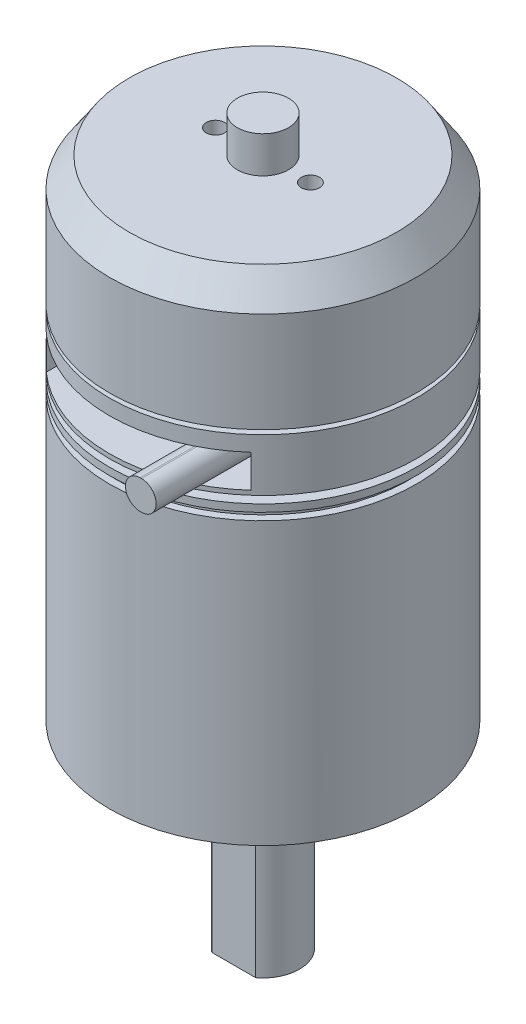
ISO-10303-21;
HEADER;
FILE_DESCRIPTION(('STEP AP214'),'2;1');
FILE_NAME('part.step','',(''),(''),'','','');
FILE_SCHEMA(('AUTOMOTIVE_DESIGN { 1 0 10303 214 1 1 1 1 }'));
ENDSEC;
DATA;
#1=APPLICATION_CONTEXT('core data for automotive mechanical design processes');
#2=APPLICATION_PROTOCOL_DEFINITION('international standard','automotive_design',2000,#1);
#3=PRODUCT_CONTEXT('',#1,'mechanical');
#4=PRODUCT('Part','Part','',(#3));
#5=PRODUCT_RELATED_PRODUCT_CATEGORY('part','',(#4));
#6=PRODUCT_DEFINITION_FORMATION('','',#4);
#7=PRODUCT_DEFINITION_CONTEXT('part definition',#1,'design');
#8=PRODUCT_DEFINITION('design','',#6,#7);
#9=PRODUCT_DEFINITION_SHAPE('','',#8);
#10=(LENGTH_UNIT() NAMED_UNIT(*) SI_UNIT(.MILLI.,.METRE.));
#11=(NAMED_UNIT(*) PLANE_ANGLE_UNIT() SI_UNIT($,.RADIAN.));
#12=(NAMED_UNIT(*) SI_UNIT($,.STERADIAN.) SOLID_ANGLE_UNIT());
#13=UNCERTAINTY_MEASURE_WITH_UNIT(LENGTH_MEASURE(1.E-05),#10,'distance_accuracy_value','');
#14=(GEOMETRIC_REPRESENTATION_CONTEXT(3) GLOBAL_UNCERTAINTY_ASSIGNED_CONTEXT((#13)) GLOBAL_UNIT_ASSIGNED_CONTEXT((#10,
#11,#12)) REPRESENTATION_CONTEXT('',''));
#15=CARTESIAN_POINT('',(0.,0.,0.));
#16=DIRECTION('',(0.,0.,1.));
#17=DIRECTION('',(1.,0.,0.));
#18=AXIS2_PLACEMENT_3D('',#15,#16,#17);
#19=CARTESIAN_POINT('',(0.,0.,11.));
#20=DIRECTION('',(0.,0.,1.));
#21=DIRECTION('',(1.,0.,0.));
#22=AXIS2_PLACEMENT_3D('',#19,#20,#21);
#23=PLANE('',#22);
#24=DIRECTION('',(0.,1.,0.));
#25=VECTOR('',#24,1.);
#26=CARTESIAN_POINT('',(14.,18.3,11.));
#27=LINE('',#26,#25);
#28=CARTESIAN_POINT('',(14.,13.8,11.));
#29=VERTEX_POINT('',#28);
#30=CARTESIAN_POINT('',(14.,18.3,11.));
#31=VERTEX_POINT('',#30);
#32=EDGE_CURVE('E238',#29,#31,#27,.T.);
#33=ORIENTED_EDGE('',*,*,#32,.T.);
#34=DIRECTION('',(-1.,0.,0.));
#35=VECTOR('',#34,1.);
#36=CARTESIAN_POINT('',(-14.,18.3,11.));
#37=LINE('',#36,#35);
#38=CARTESIAN_POINT('',(-14.,18.3,11.));
#39=VERTEX_POINT('',#38);
#40=EDGE_CURVE('E241',#31,#39,#37,.T.);
#41=ORIENTED_EDGE('',*,*,#40,.T.);
#42=DIRECTION('',(0.,-1.,0.));
#43=VECTOR('',#42,1.);
#44=CARTESIAN_POINT('',(-14.,18.3,11.));
#45=LINE('',#44,#43);
#46=CARTESIAN_POINT('',(-14.,13.8,11.));
#47=VERTEX_POINT('',#46);
#48=EDGE_CURVE('E244',#39,#47,#45,.T.);
#49=ORIENTED_EDGE('',*,*,#48,.T.);
#50=DIRECTION('',(1.,0.,0.));
#51=VECTOR('',#50,1.);
#52=CARTESIAN_POINT('',(-14.,13.8,11.));
#53=LINE('',#52,#51);
#54=EDGE_CURVE('E247',#47,#29,#53,.T.);
#55=ORIENTED_EDGE('',*,*,#54,.T.);
#56=EDGE_LOOP('',(#33,#41,#49,#55));
#57=FACE_BOUND('',#56,.T.);
#58=DIRECTION('',(1.,0.,0.));
#59=VECTOR('',#58,1.);
#60=CARTESIAN_POINT('',(9.18505632343501,14.0531944170925,11.));
#61=LINE('',#60,#59);
#62=CARTESIAN_POINT('',(9.18505632343501,14.0531944170925,11.));
#63=VERTEX_POINT('',#62);
#64=CARTESIAN_POINT('',(9.38505632343501,14.0531944170925,11.));
#65=VERTEX_POINT('',#64);
#66=EDGE_CURVE('E225',#63,#65,#61,.T.);
#67=ORIENTED_EDGE('',*,*,#66,.F.);
#68=CARTESIAN_POINT('',(9.18505632343501,16.0531944170925,11.));
#69=DIRECTION('',(0.,0.,1.));
#70=DIRECTION('',(1.,0.,0.));
#71=AXIS2_PLACEMENT_3D('',#68,#69,#70);
#72=CIRCLE('',#71,1.99999999999999);
#73=CARTESIAN_POINT('',(9.18505632343501,18.0531944170925,11.));
#74=VERTEX_POINT('',#73);
#75=EDGE_CURVE('E211',#74,#63,#72,.T.);
#76=ORIENTED_EDGE('',*,*,#75,.F.);
#77=DIRECTION('',(-1.,0.,0.));
#78=VECTOR('',#77,1.);
#79=CARTESIAN_POINT('',(9.18505632343501,18.0531944170925,11.));
#80=LINE('',#79,#78);
#81=CARTESIAN_POINT('',(9.38505632343501,18.0531944170925,11.));
#82=VERTEX_POINT('',#81);
#83=EDGE_CURVE('E216',#82,#74,#80,.T.);
#84=ORIENTED_EDGE('',*,*,#83,.F.);
#85=CARTESIAN_POINT('',(9.38505632343501,16.0531944170925,11.));
#86=DIRECTION('',(0.,0.,1.));
#87=DIRECTION('',(1.,0.,0.));
#88=AXIS2_PLACEMENT_3D('',#85,#86,#87);
#89=CIRCLE('',#88,2.);
#90=EDGE_CURVE('E227',#65,#82,#89,.T.);
#91=ORIENTED_EDGE('',*,*,#90,.F.);
#92=EDGE_LOOP('',(#67,#76,#84,#91));
#93=FACE_BOUND('',#92,.T.);
#94=ADVANCED_FACE('F41',(#57,#93),#23,.T.);
#95=CARTESIAN_POINT('',(0.,43.7,0.));
#96=DIRECTION('',(0.,1.,0.));
#97=DIRECTION('',(0.,0.,1.));
#98=AXIS2_PLACEMENT_3D('',#95,#96,#97);
#99=CYLINDRICAL_SURFACE('',#98,21.);
#100=CARTESIAN_POINT('',(0.,10.2,0.));
#101=DIRECTION('',(0.,1.,0.));
#102=DIRECTION('',(0.,0.,1.));
#103=AXIS2_PLACEMENT_3D('',#100,#101,#102);
#104=CIRCLE('',#103,21.);
#105=CARTESIAN_POINT('',(0.,10.2,21.));
#106=VERTEX_POINT('',#105);
#107=EDGE_CURVE('E307',#106,#106,#104,.T.);
#108=ORIENTED_EDGE('',*,*,#107,.F.);
#109=EDGE_LOOP('',(#108));
#110=FACE_BOUND('',#109,.T.);
#111=CARTESIAN_POINT('',(0.,-28.3,0.));
#112=DIRECTION('',(0.,1.,0.));
#113=DIRECTION('',(-1.,0.,0.));
#114=AXIS2_PLACEMENT_3D('',#111,#112,#113);
#115=CIRCLE('',#114,21.);
#116=CARTESIAN_POINT('',(-21.,-28.3,0.));
#117=VERTEX_POINT('',#116);
#118=EDGE_CURVE('E177',#117,#117,#115,.T.);
#119=ORIENTED_EDGE('',*,*,#118,.T.);
#120=EDGE_LOOP('',(#119));
#121=FACE_BOUND('',#120,.T.);
#122=ADVANCED_FACE('F43',(#110,#121),#99,.T.);
#123=CARTESIAN_POINT('',(21.,10.2,0.));
#124=DIRECTION('',(0.,-1.,0.));
#125=DIRECTION('',(0.,0.,-1.));
#126=AXIS2_PLACEMENT_3D('',#123,#124,#125);
#127=PLANE('',#126);
#128=CARTESIAN_POINT('',(0.,10.2,0.));
#129=DIRECTION('',(0.,1.,0.));
#130=DIRECTION('',(0.,0.,1.));
#131=AXIS2_PLACEMENT_3D('',#128,#129,#130);
#132=CIRCLE('',#131,20.);
#133=CARTESIAN_POINT('',(0.,10.2,20.));
#134=VERTEX_POINT('',#133);
#135=EDGE_CURVE('E304',#134,#134,#132,.T.);
#136=ORIENTED_EDGE('',*,*,#135,.F.);
#137=EDGE_LOOP('',(#136));
#138=FACE_BOUND('',#137,.T.);
#139=ORIENTED_EDGE('',*,*,#107,.T.);
#140=EDGE_LOOP('',(#139));
#141=FACE_BOUND('',#140,.T.);
#142=ADVANCED_FACE('F350',(#138,#141),#127,.F.);
#143=CARTESIAN_POINT('',(0.,43.7,0.));
#144=DIRECTION('',(0.,1.,0.));
#145=DIRECTION('',(0.,0.,1.));
#146=AXIS2_PLACEMENT_3D('',#143,#144,#145);
#147=CYLINDRICAL_SURFACE('',#146,20.);
#148=CARTESIAN_POINT('',(0.,11.2,0.));
#149=DIRECTION('',(0.,1.,0.));
#150=DIRECTION('',(0.,0.,1.));
#151=AXIS2_PLACEMENT_3D('',#148,#149,#150);
#152=CIRCLE('',#151,20.);
#153=CARTESIAN_POINT('',(0.,11.2,20.));
#154=VERTEX_POINT('',#153);
#155=EDGE_CURVE('E301',#154,#154,#152,.T.);
#156=ORIENTED_EDGE('',*,*,#155,.F.);
#157=EDGE_LOOP('',(#156));
#158=FACE_BOUND('',#157,.T.);
#159=ORIENTED_EDGE('',*,*,#135,.T.);
#160=EDGE_LOOP('',(#159));
#161=FACE_BOUND('',#160,.T.);
#162=ADVANCED_FACE('F414',(#158,#161),#147,.T.);
#163=CARTESIAN_POINT('',(20.,11.2,0.));
#164=DIRECTION('',(0.,1.,0.));
#165=DIRECTION('',(0.,0.,1.));
#166=AXIS2_PLACEMENT_3D('',#163,#164,#165);
#167=PLANE('',#166);
#168=CARTESIAN_POINT('',(0.,11.2,0.));
#169=DIRECTION('',(0.,1.,0.));
#170=DIRECTION('',(0.,0.,1.));
#171=AXIS2_PLACEMENT_3D('',#168,#169,#170);
#172=CIRCLE('',#171,21.);
#173=CARTESIAN_POINT('',(0.,11.2,21.));
#174=VERTEX_POINT('',#173);
#175=EDGE_CURVE('E298',#174,#174,#172,.T.);
#176=ORIENTED_EDGE('',*,*,#175,.F.);
#177=EDGE_LOOP('',(#176));
#178=FACE_BOUND('',#177,.T.);
#179=ORIENTED_EDGE('',*,*,#155,.T.);
#180=EDGE_LOOP('',(#179));
#181=FACE_BOUND('',#180,.T.);
#182=ADVANCED_FACE('F410',(#178,#181),#167,.F.);
#183=CARTESIAN_POINT('',(0.,43.7,0.));
#184=DIRECTION('',(0.,1.,0.));
#185=DIRECTION('',(0.,0.,1.));
#186=AXIS2_PLACEMENT_3D('',#183,#184,#185);
#187=CYLINDRICAL_SURFACE('',#186,21.);
#188=CARTESIAN_POINT('',(0.,12.2,0.));
#189=DIRECTION('',(0.,1.,0.));
#190=DIRECTION('',(0.,0.,1.));
#191=AXIS2_PLACEMENT_3D('',#188,#189,#190);
#192=CIRCLE('',#191,21.);
#193=CARTESIAN_POINT('',(0.,12.2,21.));
#194=VERTEX_POINT('',#193);
#195=EDGE_CURVE('E295',#194,#194,#192,.T.);
#196=ORIENTED_EDGE('',*,*,#195,.F.);
#197=EDGE_LOOP('',(#196));
#198=FACE_BOUND('',#197,.T.);
#199=ORIENTED_EDGE('',*,*,#175,.T.);
#200=EDGE_LOOP('',(#199));
#201=FACE_BOUND('',#200,.T.);
#202=ADVANCED_FACE('F406',(#198,#201),#187,.T.);
#203=CARTESIAN_POINT('',(21.,12.2,0.));
#204=DIRECTION('',(0.,-1.,0.));
#205=DIRECTION('',(0.,0.,-1.));
#206=AXIS2_PLACEMENT_3D('',#203,#204,#205);
#207=PLANE('',#206);
#208=CARTESIAN_POINT('',(0.,12.2,0.));
#209=DIRECTION('',(0.,1.,0.));
#210=DIRECTION('',(0.,0.,1.));
#211=AXIS2_PLACEMENT_3D('',#208,#209,#210);
#212=CIRCLE('',#211,10.);
#213=CARTESIAN_POINT('',(0.,12.2,10.));
#214=VERTEX_POINT('',#213);
#215=EDGE_CURVE('E292',#214,#214,#212,.T.);
#216=ORIENTED_EDGE('',*,*,#215,.F.);
#217=EDGE_LOOP('',(#216));
#218=FACE_BOUND('',#217,.T.);
#219=ORIENTED_EDGE('',*,*,#195,.T.);
#220=EDGE_LOOP('',(#219));
#221=FACE_BOUND('',#220,.T.);
#222=ADVANCED_FACE('F402',(#218,#221),#207,.F.);
#223=CARTESIAN_POINT('',(0.,43.7,0.));
#224=DIRECTION('',(0.,1.,0.));
#225=DIRECTION('',(0.,0.,1.));
#226=AXIS2_PLACEMENT_3D('',#223,#224,#225);
#227=CYLINDRICAL_SURFACE('',#226,10.);
#228=CARTESIAN_POINT('',(0.,13.2,0.));
#229=DIRECTION('',(0.,1.,0.));
#230=DIRECTION('',(0.,0.,1.));
#231=AXIS2_PLACEMENT_3D('',#228,#229,#230);
#232=CIRCLE('',#231,10.);
#233=CARTESIAN_POINT('',(0.,13.2,10.));
#234=VERTEX_POINT('',#233);
#235=EDGE_CURVE('E289',#234,#234,#232,.T.);
#236=ORIENTED_EDGE('',*,*,#235,.F.);
#237=EDGE_LOOP('',(#236));
#238=FACE_BOUND('',#237,.T.);
#239=ORIENTED_EDGE('',*,*,#215,.T.);
#240=EDGE_LOOP('',(#239));
#241=FACE_BOUND('',#240,.T.);
#242=ADVANCED_FACE('F398',(#238,#241),#227,.T.);
#243=CARTESIAN_POINT('',(10.,13.2,0.));
#244=DIRECTION('',(0.,1.,0.));
#245=DIRECTION('',(0.,0.,1.));
#246=AXIS2_PLACEMENT_3D('',#243,#244,#245);
#247=PLANE('',#246);
#248=CARTESIAN_POINT('',(0.,13.2,0.));
#249=DIRECTION('',(0.,1.,0.));
#250=DIRECTION('',(0.,0.,1.));
#251=AXIS2_PLACEMENT_3D('',#248,#249,#250);
#252=CIRCLE('',#251,21.);
#253=CARTESIAN_POINT('',(0.,13.2,21.));
#254=VERTEX_POINT('',#253);
#255=EDGE_CURVE('E286',#254,#254,#252,.T.);
#256=ORIENTED_EDGE('',*,*,#255,.F.);
#257=EDGE_LOOP('',(#256));
#258=FACE_BOUND('',#257,.T.);
#259=ORIENTED_EDGE('',*,*,#235,.T.);
#260=EDGE_LOOP('',(#259));
#261=FACE_BOUND('',#260,.T.);
#262=ADVANCED_FACE('F395',(#258,#261),#247,.F.);
#263=CARTESIAN_POINT('',(0.,43.7,0.));
#264=DIRECTION('',(0.,1.,0.));
#265=DIRECTION('',(0.,0.,1.));
#266=AXIS2_PLACEMENT_3D('',#263,#264,#265);
#267=CYLINDRICAL_SURFACE('',#266,21.);
#268=CARTESIAN_POINT('',(0.,18.3,0.));
#269=DIRECTION('',(0.,1.,0.));
#270=DIRECTION('',(0.,0.,1.));
#271=AXIS2_PLACEMENT_3D('',#268,#269,#270);
#272=CIRCLE('',#271,21.);
#273=CARTESIAN_POINT('',(-14.,18.3,15.6524758424985));
#274=VERTEX_POINT('',#273);
#275=CARTESIAN_POINT('',(14.,18.3,15.6524758424985));
#276=VERTEX_POINT('',#275);
#277=EDGE_CURVE('E310',#274,#276,#272,.T.);
#278=ORIENTED_EDGE('',*,*,#277,.T.);
#279=DIRECTION('',(0.,1.,0.));
#280=VECTOR('',#279,1.);
#281=CARTESIAN_POINT('',(14.,43.7,15.6524758424985));
#282=LINE('',#281,#280);
#283=CARTESIAN_POINT('',(14.,13.8,15.6524758424985));
#284=VERTEX_POINT('',#283);
#285=EDGE_CURVE('E11',#276,#284,#282,.F.);
#286=ORIENTED_EDGE('',*,*,#285,.T.);
#287=CARTESIAN_POINT('',(0.,13.8,0.));
#288=DIRECTION('',(0.,-1.,0.));
#289=DIRECTION('',(0.,0.,-1.));
#290=AXIS2_PLACEMENT_3D('',#287,#288,#289);
#291=CIRCLE('',#290,21.);
#292=CARTESIAN_POINT('',(-14.,13.8,15.6524758424985));
#293=VERTEX_POINT('',#292);
#294=EDGE_CURVE('E49',#284,#293,#291,.T.);
#295=ORIENTED_EDGE('',*,*,#294,.T.);
#296=DIRECTION('',(0.,1.,0.));
#297=VECTOR('',#296,1.);
#298=CARTESIAN_POINT('',(-14.,43.7,15.6524758424985));
#299=LINE('',#298,#297);
#300=EDGE_CURVE('E312',#293,#274,#299,.T.);
#301=ORIENTED_EDGE('',*,*,#300,.T.);
#302=EDGE_LOOP('',(#278,#286,#295,#301));
#303=FACE_BOUND('',#302,.T.);
#304=CARTESIAN_POINT('',(0.,20.4,0.));
#305=DIRECTION('',(0.,1.,0.));
#306=DIRECTION('',(0.,0.,1.));
#307=AXIS2_PLACEMENT_3D('',#304,#305,#306);
#308=CIRCLE('',#307,21.);
#309=CARTESIAN_POINT('',(0.,20.4,21.));
#310=VERTEX_POINT('',#309);
#311=EDGE_CURVE('E283',#310,#310,#308,.T.);
#312=ORIENTED_EDGE('',*,*,#311,.F.);
#313=EDGE_LOOP('',(#312));
#314=FACE_BOUND('',#313,.T.);
#315=ORIENTED_EDGE('',*,*,#255,.T.);
#316=EDGE_LOOP('',(#315));
#317=FACE_BOUND('',#316,.T.);
#318=ADVANCED_FACE('F316',(#303,#314,#317),#267,.T.);
#319=CARTESIAN_POINT('',(21.,20.4,0.));
#320=DIRECTION('',(0.,-1.,0.));
#321=DIRECTION('',(0.,0.,-1.));
#322=AXIS2_PLACEMENT_3D('',#319,#320,#321);
#323=PLANE('',#322);
#324=CARTESIAN_POINT('',(0.,20.4,0.));
#325=DIRECTION('',(0.,1.,0.));
#326=DIRECTION('',(0.,0.,1.));
#327=AXIS2_PLACEMENT_3D('',#324,#325,#326);
#328=CIRCLE('',#327,5.);
#329=CARTESIAN_POINT('',(0.,20.4,5.));
#330=VERTEX_POINT('',#329);
#331=EDGE_CURVE('E280',#330,#330,#328,.T.);
#332=ORIENTED_EDGE('',*,*,#331,.F.);
#333=EDGE_LOOP('',(#332));
#334=FACE_BOUND('',#333,.T.);
#335=ORIENTED_EDGE('',*,*,#311,.T.);
#336=EDGE_LOOP('',(#335));
#337=FACE_BOUND('',#336,.T.);
#338=ADVANCED_FACE('F388',(#334,#337),#323,.F.);
#339=CARTESIAN_POINT('',(0.,43.7,0.));
#340=DIRECTION('',(0.,1.,0.));
#341=DIRECTION('',(0.,0.,1.));
#342=AXIS2_PLACEMENT_3D('',#339,#340,#341);
#343=CYLINDRICAL_SURFACE('',#342,5.);
#344=CARTESIAN_POINT('',(0.,21.,0.));
#345=DIRECTION('',(0.,1.,0.));
#346=DIRECTION('',(0.,0.,1.));
#347=AXIS2_PLACEMENT_3D('',#344,#345,#346);
#348=CIRCLE('',#347,5.);
#349=CARTESIAN_POINT('',(0.,21.,5.));
#350=VERTEX_POINT('',#349);
#351=EDGE_CURVE('E277',#350,#350,#348,.T.);
#352=ORIENTED_EDGE('',*,*,#351,.F.);
#353=EDGE_LOOP('',(#352));
#354=FACE_BOUND('',#353,.T.);
#355=ORIENTED_EDGE('',*,*,#331,.T.);
#356=EDGE_LOOP('',(#355));
#357=FACE_BOUND('',#356,.T.);
#358=ADVANCED_FACE('F384',(#354,#357),#343,.T.);
#359=CARTESIAN_POINT('',(5.,21.,0.));
#360=DIRECTION('',(0.,1.,0.));
#361=DIRECTION('',(0.,0.,1.));
#362=AXIS2_PLACEMENT_3D('',#359,#360,#361);
#363=PLANE('',#362);
#364=CARTESIAN_POINT('',(0.,21.,0.));
#365=DIRECTION('',(0.,1.,0.));
#366=DIRECTION('',(0.,0.,1.));
#367=AXIS2_PLACEMENT_3D('',#364,#365,#366);
#368=CIRCLE('',#367,21.);
#369=CARTESIAN_POINT('',(0.,21.,21.));
#370=VERTEX_POINT('',#369);
#371=EDGE_CURVE('E274',#370,#370,#368,.T.);
#372=ORIENTED_EDGE('',*,*,#371,.F.);
#373=EDGE_LOOP('',(#372));
#374=FACE_BOUND('',#373,.T.);
#375=ORIENTED_EDGE('',*,*,#351,.T.);
#376=EDGE_LOOP('',(#375));
#377=FACE_BOUND('',#376,.T.);
#378=ADVANCED_FACE('F380',(#374,#377),#363,.F.);
#379=CARTESIAN_POINT('',(0.,43.7,0.));
#380=DIRECTION('',(0.,1.,0.));
#381=DIRECTION('',(0.,0.,1.));
#382=AXIS2_PLACEMENT_3D('',#379,#380,#381);
#383=CYLINDRICAL_SURFACE('',#382,21.);
#384=CARTESIAN_POINT('',(0.,34.7,0.));
#385=DIRECTION('',(0.,1.,0.));
#386=DIRECTION('',(0.,0.,1.));
#387=AXIS2_PLACEMENT_3D('',#384,#385,#386);
#388=CIRCLE('',#387,21.);
#389=CARTESIAN_POINT('',(0.,34.7,21.));
#390=VERTEX_POINT('',#389);
#391=EDGE_CURVE('E271',#390,#390,#388,.T.);
#392=ORIENTED_EDGE('',*,*,#391,.F.);
#393=EDGE_LOOP('',(#392));
#394=FACE_BOUND('',#393,.T.);
#395=ORIENTED_EDGE('',*,*,#371,.T.);
#396=EDGE_LOOP('',(#395));
#397=FACE_BOUND('',#396,.T.);
#398=ADVANCED_FACE('F376',(#394,#397),#383,.T.);
#399=CARTESIAN_POINT('',(0.,34.7,0.));
#400=DIRECTION('',(0.,-1.,0.));
#401=DIRECTION('',(0.,0.,-1.));
#402=AXIS2_PLACEMENT_3D('',#399,#400,#401);
#403=CONICAL_SURFACE('',#402,21.,0.593749666710772);
#404=CARTESIAN_POINT('',(0.,38.7,0.));
#405=DIRECTION('',(0.,1.,0.));
#406=DIRECTION('',(0.,0.,1.));
#407=AXIS2_PLACEMENT_3D('',#404,#405,#406);
#408=CIRCLE('',#407,18.3);
#409=CARTESIAN_POINT('',(0.,38.7,18.3));
#410=VERTEX_POINT('',#409);
#411=EDGE_CURVE('E268',#410,#410,#408,.T.);
#412=ORIENTED_EDGE('',*,*,#411,.F.);
#413=EDGE_LOOP('',(#412));
#414=FACE_BOUND('',#413,.T.);
#415=ORIENTED_EDGE('',*,*,#391,.T.);
#416=EDGE_LOOP('',(#415));
#417=FACE_BOUND('',#416,.T.);
#418=ADVANCED_FACE('F372',(#414,#417),#403,.T.);
#419=CARTESIAN_POINT('',(18.3,38.7,0.));
#420=DIRECTION('',(0.,-1.,0.));
#421=DIRECTION('',(0.,0.,-1.));
#422=AXIS2_PLACEMENT_3D('',#419,#420,#421);
#423=PLANE('',#422);
#424=CARTESIAN_POINT('',(-6.5,38.7,0.));
#425=DIRECTION('',(0.,1.,0.));
#426=DIRECTION('',(0.,0.,1.));
#427=AXIS2_PLACEMENT_3D('',#424,#425,#426);
#428=CIRCLE('',#427,1.24999999999999);
#429=CARTESIAN_POINT('',(-6.5,38.7,1.24999999999999));
#430=VERTEX_POINT('',#429);
#431=EDGE_CURVE('E199',#430,#430,#428,.T.);
#432=ORIENTED_EDGE('',*,*,#431,.F.);
#433=EDGE_LOOP('',(#432));
#434=FACE_BOUND('',#433,.T.);
#435=CARTESIAN_POINT('',(6.5,38.7,0.));
#436=DIRECTION('',(0.,1.,0.));
#437=DIRECTION('',(0.,0.,1.));
#438=AXIS2_PLACEMENT_3D('',#435,#436,#437);
#439=CIRCLE('',#438,1.24999999999999);
#440=CARTESIAN_POINT('',(6.5,38.7,1.24999999999999));
#441=VERTEX_POINT('',#440);
#442=EDGE_CURVE('E205',#441,#441,#439,.T.);
#443=ORIENTED_EDGE('',*,*,#442,.F.);
#444=EDGE_LOOP('',(#443));
#445=FACE_BOUND('',#444,.T.);
#446=CARTESIAN_POINT('',(0.,38.7,0.));
#447=DIRECTION('',(0.,1.,0.));
#448=DIRECTION('',(0.,0.,1.));
#449=AXIS2_PLACEMENT_3D('',#446,#447,#448);
#450=CIRCLE('',#449,3.5);
#451=CARTESIAN_POINT('',(0.,38.7,3.5));
#452=VERTEX_POINT('',#451);
#453=EDGE_CURVE('E265',#452,#452,#450,.T.);
#454=ORIENTED_EDGE('',*,*,#453,.F.);
#455=EDGE_LOOP('',(#454));
#456=FACE_BOUND('',#455,.T.);
#457=ORIENTED_EDGE('',*,*,#411,.T.);
#458=EDGE_LOOP('',(#457));
#459=FACE_BOUND('',#458,.T.);
#460=ADVANCED_FACE('F368',(#434,#445,#456,#459),#423,.F.);
#461=CARTESIAN_POINT('',(0.,43.7,0.));
#462=DIRECTION('',(0.,1.,0.));
#463=DIRECTION('',(0.,0.,1.));
#464=AXIS2_PLACEMENT_3D('',#461,#462,#463);
#465=CYLINDRICAL_SURFACE('',#464,3.5);
#466=CARTESIAN_POINT('',(0.,43.7,0.));
#467=DIRECTION('',(0.,1.,0.));
#468=DIRECTION('',(0.,0.,1.));
#469=AXIS2_PLACEMENT_3D('',#466,#467,#468);
#470=CIRCLE('',#469,3.5);
#471=CARTESIAN_POINT('',(0.,43.7,3.5));
#472=VERTEX_POINT('',#471);
#473=EDGE_CURVE('E254',#472,#472,#470,.T.);
#474=ORIENTED_EDGE('',*,*,#473,.F.);
#475=EDGE_LOOP('',(#474));
#476=FACE_BOUND('',#475,.T.);
#477=ORIENTED_EDGE('',*,*,#453,.T.);
#478=EDGE_LOOP('',(#477));
#479=FACE_BOUND('',#478,.T.);
#480=ADVANCED_FACE('F362',(#476,#479),#465,.T.);
#481=CARTESIAN_POINT('',(3.5,43.7,0.));
#482=DIRECTION('',(0.,-1.,0.));
#483=DIRECTION('',(0.,0.,-1.));
#484=AXIS2_PLACEMENT_3D('',#481,#482,#483);
#485=PLANE('',#484);
#486=ORIENTED_EDGE('',*,*,#473,.T.);
#487=EDGE_LOOP('',(#486));
#488=FACE_BOUND('',#487,.T.);
#489=ADVANCED_FACE('F358',(#488),#485,.F.);
#490=CARTESIAN_POINT('',(14.,18.3,11.));
#491=DIRECTION('',(1.,0.,0.));
#492=DIRECTION('',(0.,0.,-1.));
#493=AXIS2_PLACEMENT_3D('',#490,#491,#492);
#494=PLANE('',#493);
#495=DIRECTION('',(0.,0.,1.));
#496=VECTOR('',#495,1.);
#497=CARTESIAN_POINT('',(14.,18.3,11.));
#498=LINE('',#497,#496);
#499=EDGE_CURVE('E250',#31,#276,#498,.T.);
#500=ORIENTED_EDGE('',*,*,#499,.F.);
#501=ORIENTED_EDGE('',*,*,#32,.F.);
#502=DIRECTION('',(0.,0.,1.));
#503=VECTOR('',#502,1.);
#504=CARTESIAN_POINT('',(14.,13.8,11.));
#505=LINE('',#504,#503);
#506=EDGE_CURVE('E251',#29,#284,#505,.T.);
#507=ORIENTED_EDGE('',*,*,#506,.T.);
#508=ORIENTED_EDGE('',*,*,#285,.F.);
#509=EDGE_LOOP('',(#500,#501,#507,#508));
#510=FACE_BOUND('',#509,.T.);
#511=ADVANCED_FACE('F324',(#510),#494,.F.);
#512=CARTESIAN_POINT('',(-14.,13.8,11.));
#513=DIRECTION('',(0.,-1.,0.));
#514=DIRECTION('',(0.,0.,-1.));
#515=AXIS2_PLACEMENT_3D('',#512,#513,#514);
#516=PLANE('',#515);
#517=ORIENTED_EDGE('',*,*,#506,.F.);
#518=ORIENTED_EDGE('',*,*,#54,.F.);
#519=DIRECTION('',(0.,0.,1.));
#520=VECTOR('',#519,1.);
#521=CARTESIAN_POINT('',(-14.,13.8,11.));
#522=LINE('',#521,#520);
#523=EDGE_CURVE('E255',#47,#293,#522,.T.);
#524=ORIENTED_EDGE('',*,*,#523,.T.);
#525=ORIENTED_EDGE('',*,*,#294,.F.);
#526=EDGE_LOOP('',(#517,#518,#524,#525));
#527=FACE_BOUND('',#526,.T.);
#528=ADVANCED_FACE('F320',(#527),#516,.F.);
#529=CARTESIAN_POINT('',(-14.,18.3,11.));
#530=DIRECTION('',(-1.,0.,0.));
#531=DIRECTION('',(0.,-1.,0.));
#532=AXIS2_PLACEMENT_3D('',#529,#530,#531);
#533=PLANE('',#532);
#534=ORIENTED_EDGE('',*,*,#523,.F.);
#535=ORIENTED_EDGE('',*,*,#48,.F.);
#536=DIRECTION('',(0.,0.,1.));
#537=VECTOR('',#536,1.);
#538=CARTESIAN_POINT('',(-14.,18.3,11.));
#539=LINE('',#538,#537);
#540=EDGE_CURVE('E258',#39,#274,#539,.T.);
#541=ORIENTED_EDGE('',*,*,#540,.T.);
#542=ORIENTED_EDGE('',*,*,#300,.F.);
#543=EDGE_LOOP('',(#534,#535,#541,#542));
#544=FACE_BOUND('',#543,.T.);
#545=ADVANCED_FACE('F330',(#544),#533,.F.);
#546=CARTESIAN_POINT('',(-14.,18.3,11.));
#547=DIRECTION('',(0.,1.,0.));
#548=DIRECTION('',(0.,0.,1.));
#549=AXIS2_PLACEMENT_3D('',#546,#547,#548);
#550=PLANE('',#549);
#551=ORIENTED_EDGE('',*,*,#277,.F.);
#552=ORIENTED_EDGE('',*,*,#540,.F.);
#553=ORIENTED_EDGE('',*,*,#40,.F.);
#554=ORIENTED_EDGE('',*,*,#499,.T.);
#555=EDGE_LOOP('',(#551,#552,#553,#554));
#556=FACE_BOUND('',#555,.T.);
#557=ADVANCED_FACE('F332',(#556),#550,.F.);
#558=CARTESIAN_POINT('',(9.18505632343501,16.0531944170925,26.));
#559=DIRECTION('',(0.,0.,-1.));
#560=DIRECTION('',(-1.,0.,0.));
#561=AXIS2_PLACEMENT_3D('',#558,#559,#560);
#562=CYLINDRICAL_SURFACE('',#561,1.99999999999999);
#563=ORIENTED_EDGE('',*,*,#75,.T.);
#564=DIRECTION('',(0.,0.,-1.));
#565=VECTOR('',#564,1.);
#566=CARTESIAN_POINT('',(9.18505632343501,14.0531944170925,26.));
#567=LINE('',#566,#565);
#568=CARTESIAN_POINT('',(9.18505632343501,14.0531944170925,26.));
#569=VERTEX_POINT('',#568);
#570=EDGE_CURVE('E236',#569,#63,#567,.T.);
#571=ORIENTED_EDGE('',*,*,#570,.F.);
#572=CARTESIAN_POINT('',(9.18505632343501,16.0531944170925,26.));
#573=DIRECTION('',(0.,0.,1.));
#574=DIRECTION('',(1.,0.,0.));
#575=AXIS2_PLACEMENT_3D('',#572,#573,#574);
#576=CIRCLE('',#575,1.99999999999999);
#577=CARTESIAN_POINT('',(9.18505632343501,18.0531944170925,26.));
#578=VERTEX_POINT('',#577);
#579=EDGE_CURVE('E212',#578,#569,#576,.T.);
#580=ORIENTED_EDGE('',*,*,#579,.F.);
#581=DIRECTION('',(0.,0.,-1.));
#582=VECTOR('',#581,1.);
#583=CARTESIAN_POINT('',(9.18505632343501,18.0531944170925,26.));
#584=LINE('',#583,#582);
#585=EDGE_CURVE('E222',#578,#74,#584,.T.);
#586=ORIENTED_EDGE('',*,*,#585,.T.);
#587=EDGE_LOOP('',(#563,#571,#580,#586));
#588=FACE_BOUND('',#587,.T.);
#589=ADVANCED_FACE('F334',(#588),#562,.T.);
#590=CARTESIAN_POINT('',(9.18505632343501,14.0531944170925,26.));
#591=DIRECTION('',(0.,1.,0.));
#592=DIRECTION('',(-1.,0.,0.));
#593=AXIS2_PLACEMENT_3D('',#590,#591,#592);
#594=PLANE('',#593);
#595=ORIENTED_EDGE('',*,*,#66,.T.);
#596=DIRECTION('',(0.,0.,-1.));
#597=VECTOR('',#596,1.);
#598=CARTESIAN_POINT('',(9.38505632343501,14.0531944170925,26.));
#599=LINE('',#598,#597);
#600=CARTESIAN_POINT('',(9.38505632343501,14.0531944170925,26.));
#601=VERTEX_POINT('',#600);
#602=EDGE_CURVE('E233',#601,#65,#599,.T.);
#603=ORIENTED_EDGE('',*,*,#602,.F.);
#604=DIRECTION('',(1.,0.,0.));
#605=VECTOR('',#604,1.);
#606=CARTESIAN_POINT('',(9.18505632343501,14.0531944170925,26.));
#607=LINE('',#606,#605);
#608=EDGE_CURVE('E215',#569,#601,#607,.T.);
#609=ORIENTED_EDGE('',*,*,#608,.F.);
#610=ORIENTED_EDGE('',*,*,#570,.T.);
#611=EDGE_LOOP('',(#595,#603,#609,#610));
#612=FACE_BOUND('',#611,.T.);
#613=ADVANCED_FACE('F340',(#612),#594,.F.);
#614=CARTESIAN_POINT('',(9.38505632343501,16.0531944170925,26.));
#615=DIRECTION('',(0.,0.,-1.));
#616=DIRECTION('',(-1.,0.,0.));
#617=AXIS2_PLACEMENT_3D('',#614,#615,#616);
#618=CYLINDRICAL_SURFACE('',#617,2.);
#619=ORIENTED_EDGE('',*,*,#90,.T.);
#620=DIRECTION('',(0.,0.,-1.));
#621=VECTOR('',#620,1.);
#622=CARTESIAN_POINT('',(9.38505632343501,18.0531944170925,26.));
#623=LINE('',#622,#621);
#624=CARTESIAN_POINT('',(9.38505632343501,18.0531944170925,26.));
#625=VERTEX_POINT('',#624);
#626=EDGE_CURVE('E63',#625,#82,#623,.T.);
#627=ORIENTED_EDGE('',*,*,#626,.F.);
#628=CARTESIAN_POINT('',(9.38505632343501,16.0531944170925,26.));
#629=DIRECTION('',(0.,0.,1.));
#630=DIRECTION('',(1.,0.,0.));
#631=AXIS2_PLACEMENT_3D('',#628,#629,#630);
#632=CIRCLE('',#631,2.);
#633=EDGE_CURVE('E218',#601,#625,#632,.T.);
#634=ORIENTED_EDGE('',*,*,#633,.F.);
#635=ORIENTED_EDGE('',*,*,#602,.T.);
#636=EDGE_LOOP('',(#619,#627,#634,#635));
#637=FACE_BOUND('',#636,.T.);
#638=ADVANCED_FACE('F494',(#637),#618,.T.);
#639=CARTESIAN_POINT('',(9.18505632343501,18.0531944170925,26.));
#640=DIRECTION('',(0.,-1.,0.));
#641=DIRECTION('',(1.,0.,0.));
#642=AXIS2_PLACEMENT_3D('',#639,#640,#641);
#643=PLANE('',#642);
#644=ORIENTED_EDGE('',*,*,#83,.T.);
#645=ORIENTED_EDGE('',*,*,#585,.F.);
#646=DIRECTION('',(-1.,0.,0.));
#647=VECTOR('',#646,1.);
#648=CARTESIAN_POINT('',(9.18505632343501,18.0531944170925,26.));
#649=LINE('',#648,#647);
#650=EDGE_CURVE('E220',#625,#578,#649,.T.);
#651=ORIENTED_EDGE('',*,*,#650,.F.);
#652=ORIENTED_EDGE('',*,*,#626,.T.);
#653=EDGE_LOOP('',(#644,#645,#651,#652));
#654=FACE_BOUND('',#653,.T.);
#655=ADVANCED_FACE('F490',(#654),#643,.F.);
#656=CARTESIAN_POINT('',(9.18505632343501,16.0531944170925,26.));
#657=DIRECTION('',(0.,0.,1.));
#658=DIRECTION('',(1.,0.,0.));
#659=AXIS2_PLACEMENT_3D('',#656,#657,#658);
#660=PLANE('',#659);
#661=ORIENTED_EDGE('',*,*,#579,.T.);
#662=ORIENTED_EDGE('',*,*,#608,.T.);
#663=ORIENTED_EDGE('',*,*,#633,.T.);
#664=ORIENTED_EDGE('',*,*,#650,.T.);
#665=EDGE_LOOP('',(#661,#662,#663,#664));
#666=FACE_BOUND('',#665,.T.);
#667=ADVANCED_FACE('F486',(#666),#660,.T.);
#668=CARTESIAN_POINT('',(6.5,34.7,0.));
#669=DIRECTION('',(0.,1.,0.));
#670=DIRECTION('',(0.,0.,1.));
#671=AXIS2_PLACEMENT_3D('',#668,#669,#670);
#672=CONICAL_SURFACE('',#671,1.25,1.02974425867665);
#673=CARTESIAN_POINT('',(6.5,33.9489242262155,0.));
#674=VERTEX_POINT('',#673);
#675=VERTEX_LOOP('',#674);
#676=FACE_BOUND('',#675,.T.);
#677=CARTESIAN_POINT('',(6.5,34.7,0.));
#678=DIRECTION('',(0.,1.,0.));
#679=DIRECTION('',(0.,0.,1.));
#680=AXIS2_PLACEMENT_3D('',#677,#678,#679);
#681=CIRCLE('',#680,1.25);
#682=CARTESIAN_POINT('',(6.5,34.7,1.25));
#683=VERTEX_POINT('',#682);
#684=EDGE_CURVE('E208',#683,#683,#681,.T.);
#685=ORIENTED_EDGE('',*,*,#684,.T.);
#686=EDGE_LOOP('',(#685));
#687=FACE_BOUND('',#686,.T.);
#688=ADVANCED_FACE('F482',(#676,#687),#672,.F.);
#689=CARTESIAN_POINT('',(6.5,38.7,0.));
#690=DIRECTION('',(0.,1.,0.));
#691=DIRECTION('',(0.,0.,1.));
#692=AXIS2_PLACEMENT_3D('',#689,#690,#691);
#693=CYLINDRICAL_SURFACE('',#692,1.24999999999999);
#694=ORIENTED_EDGE('',*,*,#684,.F.);
#695=EDGE_LOOP('',(#694));
#696=FACE_BOUND('',#695,.T.);
#697=ORIENTED_EDGE('',*,*,#442,.T.);
#698=EDGE_LOOP('',(#697));
#699=FACE_BOUND('',#698,.T.);
#700=ADVANCED_FACE('F478',(#696,#699),#693,.F.);
#701=CARTESIAN_POINT('',(-6.5,34.7,0.));
#702=DIRECTION('',(0.,1.,0.));
#703=DIRECTION('',(0.,0.,1.));
#704=AXIS2_PLACEMENT_3D('',#701,#702,#703);
#705=CONICAL_SURFACE('',#704,1.25,1.02974425867665);
#706=CARTESIAN_POINT('',(-6.5,33.9489242262155,0.));
#707=VERTEX_POINT('',#706);
#708=VERTEX_LOOP('',#707);
#709=FACE_BOUND('',#708,.T.);
#710=CARTESIAN_POINT('',(-6.5,34.7,0.));
#711=DIRECTION('',(0.,1.,0.));
#712=DIRECTION('',(0.,0.,1.));
#713=AXIS2_PLACEMENT_3D('',#710,#711,#712);
#714=CIRCLE('',#713,1.25);
#715=CARTESIAN_POINT('',(-6.5,34.7,1.25));
#716=VERTEX_POINT('',#715);
#717=EDGE_CURVE('E202',#716,#716,#714,.T.);
#718=ORIENTED_EDGE('',*,*,#717,.T.);
#719=EDGE_LOOP('',(#718));
#720=FACE_BOUND('',#719,.T.);
#721=ADVANCED_FACE('F474',(#709,#720),#705,.F.);
#722=CARTESIAN_POINT('',(-6.5,38.7,0.));
#723=DIRECTION('',(0.,1.,0.));
#724=DIRECTION('',(0.,0.,1.));
#725=AXIS2_PLACEMENT_3D('',#722,#723,#724);
#726=CYLINDRICAL_SURFACE('',#725,1.24999999999999);
#727=ORIENTED_EDGE('',*,*,#717,.F.);
#728=EDGE_LOOP('',(#727));
#729=FACE_BOUND('',#728,.T.);
#730=ORIENTED_EDGE('',*,*,#431,.T.);
#731=EDGE_LOOP('',(#730));
#732=FACE_BOUND('',#731,.T.);
#733=ADVANCED_FACE('F468',(#729,#732),#726,.F.);
#734=CARTESIAN_POINT('',(0.,-55.3,0.));
#735=DIRECTION('',(0.,1.,0.));
#736=DIRECTION('',(-1.,0.,0.));
#737=AXIS2_PLACEMENT_3D('',#734,#735,#736);
#738=PLANE('',#737);
#739=CARTESIAN_POINT('',(0.,-55.3,0.));
#740=DIRECTION('',(0.,1.,0.));
#741=DIRECTION('',(-1.,0.,0.));
#742=AXIS2_PLACEMENT_3D('',#739,#740,#741);
#743=CIRCLE('',#742,5.);
#744=CARTESIAN_POINT('',(3.00000000000002,-55.3,4.));
#745=VERTEX_POINT('',#744);
#746=CARTESIAN_POINT('',(-3.,-55.3,4.));
#747=VERTEX_POINT('',#746);
#748=EDGE_CURVE('E196',#745,#747,#743,.T.);
#749=ORIENTED_EDGE('',*,*,#748,.F.);
#750=DIRECTION('',(1.,0.,0.));
#751=VECTOR('',#750,1.);
#752=CARTESIAN_POINT('',(-3.,-55.3,4.));
#753=LINE('',#752,#751);
#754=EDGE_CURVE('E168',#747,#745,#753,.T.);
#755=ORIENTED_EDGE('',*,*,#754,.F.);
#756=EDGE_LOOP('',(#749,#755));
#757=FACE_BOUND('',#756,.T.);
#758=ADVANCED_FACE('F462',(#757),#738,.F.);
#759=CARTESIAN_POINT('',(0.,8.7,0.));
#760=DIRECTION('',(0.,1.,0.));
#761=DIRECTION('',(-1.,0.,0.));
#762=AXIS2_PLACEMENT_3D('',#759,#760,#761);
#763=CYLINDRICAL_SURFACE('',#762,5.);
#764=ORIENTED_EDGE('',*,*,#748,.T.);
#765=DIRECTION('',(0.,-1.,0.));
#766=VECTOR('',#765,1.);
#767=CARTESIAN_POINT('',(-3.,-35.3,4.));
#768=LINE('',#767,#766);
#769=CARTESIAN_POINT('',(-3.,-35.3,4.));
#770=VERTEX_POINT('',#769);
#771=EDGE_CURVE('E172',#770,#747,#768,.T.);
#772=ORIENTED_EDGE('',*,*,#771,.F.);
#773=CARTESIAN_POINT('',(0.,-35.3,0.));
#774=DIRECTION('',(0.,-1.,0.));
#775=DIRECTION('',(1.,0.,0.));
#776=AXIS2_PLACEMENT_3D('',#773,#774,#775);
#777=CIRCLE('',#776,5.);
#778=CARTESIAN_POINT('',(3.00000000000001,-35.3,4.));
#779=VERTEX_POINT('',#778);
#780=EDGE_CURVE('E169',#779,#770,#777,.T.);
#781=ORIENTED_EDGE('',*,*,#780,.F.);
#782=DIRECTION('',(0.,-1.,0.));
#783=VECTOR('',#782,1.);
#784=CARTESIAN_POINT('',(3.00000000000001,-35.3,4.));
#785=LINE('',#784,#783);
#786=EDGE_CURVE('E174',#779,#745,#785,.T.);
#787=ORIENTED_EDGE('',*,*,#786,.T.);
#788=EDGE_LOOP('',(#764,#772,#781,#787));
#789=FACE_BOUND('',#788,.T.);
#790=CARTESIAN_POINT('',(0.,-31.2,0.));
#791=DIRECTION('',(0.,1.,0.));
#792=DIRECTION('',(-1.,0.,0.));
#793=AXIS2_PLACEMENT_3D('',#790,#791,#792);
#794=CIRCLE('',#793,5.);
#795=CARTESIAN_POINT('',(-5.,-31.2,0.));
#796=VERTEX_POINT('',#795);
#797=EDGE_CURVE('E193',#796,#796,#794,.T.);
#798=ORIENTED_EDGE('',*,*,#797,.F.);
#799=EDGE_LOOP('',(#798));
#800=FACE_BOUND('',#799,.T.);
#801=ADVANCED_FACE('F457',(#789,#800),#763,.T.);
#802=CARTESIAN_POINT('',(5.00000000000001,-31.2,0.));
#803=DIRECTION('',(0.,1.,0.));
#804=DIRECTION('',(-1.,0.,0.));
#805=AXIS2_PLACEMENT_3D('',#802,#803,#804);
#806=PLANE('',#805);
#807=CARTESIAN_POINT('',(0.,-31.2,0.));
#808=DIRECTION('',(0.,1.,0.));
#809=DIRECTION('',(-1.,0.,0.));
#810=AXIS2_PLACEMENT_3D('',#807,#808,#809);
#811=CIRCLE('',#810,8.275);
#812=CARTESIAN_POINT('',(-8.275,-31.2,0.));
#813=VERTEX_POINT('',#812);
#814=EDGE_CURVE('E190',#813,#813,#811,.T.);
#815=ORIENTED_EDGE('',*,*,#814,.F.);
#816=EDGE_LOOP('',(#815));
#817=FACE_BOUND('',#816,.T.);
#818=ORIENTED_EDGE('',*,*,#797,.T.);
#819=EDGE_LOOP('',(#818));
#820=FACE_BOUND('',#819,.T.);
#821=ADVANCED_FACE('F451',(#817,#820),#806,.F.);
#822=CARTESIAN_POINT('',(0.,8.7,0.));
#823=DIRECTION('',(0.,1.,0.));
#824=DIRECTION('',(-1.,0.,0.));
#825=AXIS2_PLACEMENT_3D('',#822,#823,#824);
#826=CYLINDRICAL_SURFACE('',#825,8.275);
#827=CARTESIAN_POINT('',(0.,-30.3,0.));
#828=DIRECTION('',(0.,1.,0.));
#829=DIRECTION('',(-1.,0.,0.));
#830=AXIS2_PLACEMENT_3D('',#827,#828,#829);
#831=CIRCLE('',#830,8.275);
#832=CARTESIAN_POINT('',(-8.275,-30.3,0.));
#833=VERTEX_POINT('',#832);
#834=EDGE_CURVE('E187',#833,#833,#831,.T.);
#835=ORIENTED_EDGE('',*,*,#834,.F.);
#836=EDGE_LOOP('',(#835));
#837=FACE_BOUND('',#836,.T.);
#838=ORIENTED_EDGE('',*,*,#814,.T.);
#839=EDGE_LOOP('',(#838));
#840=FACE_BOUND('',#839,.T.);
#841=ADVANCED_FACE('F445',(#837,#840),#826,.T.);
#842=CARTESIAN_POINT('',(13.,-30.3,0.));
#843=DIRECTION('',(0.,1.,0.));
#844=DIRECTION('',(-1.,0.,0.));
#845=AXIS2_PLACEMENT_3D('',#842,#843,#844);
#846=PLANE('',#845);
#847=CARTESIAN_POINT('',(0.,-30.3,0.));
#848=DIRECTION('',(0.,1.,0.));
#849=DIRECTION('',(-1.,0.,0.));
#850=AXIS2_PLACEMENT_3D('',#847,#848,#849);
#851=CIRCLE('',#850,13.);
#852=CARTESIAN_POINT('',(-13.,-30.3,0.));
#853=VERTEX_POINT('',#852);
#854=EDGE_CURVE('E184',#853,#853,#851,.T.);
#855=ORIENTED_EDGE('',*,*,#854,.F.);
#856=EDGE_LOOP('',(#855));
#857=FACE_BOUND('',#856,.T.);
#858=ORIENTED_EDGE('',*,*,#834,.T.);
#859=EDGE_LOOP('',(#858));
#860=FACE_BOUND('',#859,.T.);
#861=ADVANCED_FACE('F439',(#857,#860),#846,.F.);
#862=CARTESIAN_POINT('',(0.,8.7,0.));
#863=DIRECTION('',(0.,1.,0.));
#864=DIRECTION('',(-1.,0.,0.));
#865=AXIS2_PLACEMENT_3D('',#862,#863,#864);
#866=CYLINDRICAL_SURFACE('',#865,13.);
#867=CARTESIAN_POINT('',(0.,-28.3,0.));
#868=DIRECTION('',(0.,1.,0.));
#869=DIRECTION('',(-1.,0.,0.));
#870=AXIS2_PLACEMENT_3D('',#867,#868,#869);
#871=CIRCLE('',#870,13.);
#872=CARTESIAN_POINT('',(-13.,-28.3,0.));
#873=VERTEX_POINT('',#872);
#874=EDGE_CURVE('E181',#873,#873,#871,.T.);
#875=ORIENTED_EDGE('',*,*,#874,.F.);
#876=EDGE_LOOP('',(#875));
#877=FACE_BOUND('',#876,.T.);
#878=ORIENTED_EDGE('',*,*,#854,.T.);
#879=EDGE_LOOP('',(#878));
#880=FACE_BOUND('',#879,.T.);
#881=ADVANCED_FACE('F432',(#877,#880),#866,.T.);
#882=CARTESIAN_POINT('',(13.,-28.3,0.));
#883=DIRECTION('',(0.,1.,0.));
#884=DIRECTION('',(-1.,0.,0.));
#885=AXIS2_PLACEMENT_3D('',#882,#883,#884);
#886=PLANE('',#885);
#887=CARTESIAN_POINT('',(0.,-28.3,17.5));
#888=DIRECTION('',(0.,-1.,0.));
#889=DIRECTION('',(0.,0.,-1.));
#890=AXIS2_PLACEMENT_3D('',#887,#888,#889);
#891=CIRCLE('',#890,1.65);
#892=CARTESIAN_POINT('',(0.,-28.3,15.85));
#893=VERTEX_POINT('',#892);
#894=EDGE_CURVE('E146',#893,#893,#891,.T.);
#895=ORIENTED_EDGE('',*,*,#894,.F.);
#896=EDGE_LOOP('',(#895));
#897=FACE_BOUND('',#896,.T.);
#898=CARTESIAN_POINT('',(17.5,-28.3,0.));
#899=DIRECTION('',(0.,-1.,0.));
#900=DIRECTION('',(0.,0.,-1.));
#901=AXIS2_PLACEMENT_3D('',#898,#899,#900);
#902=CIRCLE('',#901,1.65);
#903=CARTESIAN_POINT('',(17.5,-28.3,-1.65));
#904=VERTEX_POINT('',#903);
#905=EDGE_CURVE('E145',#904,#904,#902,.T.);
#906=ORIENTED_EDGE('',*,*,#905,.F.);
#907=EDGE_LOOP('',(#906));
#908=FACE_BOUND('',#907,.T.);
#909=CARTESIAN_POINT('',(0.,-28.3,-17.5));
#910=DIRECTION('',(0.,-1.,0.));
#911=DIRECTION('',(0.,0.,-1.));
#912=AXIS2_PLACEMENT_3D('',#909,#910,#911);
#913=CIRCLE('',#912,1.65);
#914=CARTESIAN_POINT('',(0.,-28.3,-19.15));
#915=VERTEX_POINT('',#914);
#916=EDGE_CURVE('E156',#915,#915,#913,.T.);
#917=ORIENTED_EDGE('',*,*,#916,.F.);
#918=EDGE_LOOP('',(#917));
#919=FACE_BOUND('',#918,.T.);
#920=CARTESIAN_POINT('',(-17.5,-28.3,0.));
#921=DIRECTION('',(0.,-1.,0.));
#922=DIRECTION('',(0.,0.,-1.));
#923=AXIS2_PLACEMENT_3D('',#920,#921,#922);
#924=CIRCLE('',#923,1.65);
#925=CARTESIAN_POINT('',(-17.5,-28.3,-1.65));
#926=VERTEX_POINT('',#925);
#927=EDGE_CURVE('E162',#926,#926,#924,.T.);
#928=ORIENTED_EDGE('',*,*,#927,.F.);
#929=EDGE_LOOP('',(#928));
#930=FACE_BOUND('',#929,.T.);
#931=ORIENTED_EDGE('',*,*,#118,.F.);
#932=EDGE_LOOP('',(#931));
#933=FACE_BOUND('',#932,.T.);
#934=ORIENTED_EDGE('',*,*,#874,.T.);
#935=EDGE_LOOP('',(#934));
#936=FACE_BOUND('',#935,.T.);
#937=ADVANCED_FACE('F428',(#897,#908,#919,#930,#933,#936),#886,.F.);
#938=CARTESIAN_POINT('',(-3.,-35.3,4.));
#939=DIRECTION('',(0.,0.,-1.));
#940=DIRECTION('',(-1.,0.,0.));
#941=AXIS2_PLACEMENT_3D('',#938,#939,#940);
#942=PLANE('',#941);
#943=ORIENTED_EDGE('',*,*,#754,.T.);
#944=ORIENTED_EDGE('',*,*,#786,.F.);
#945=DIRECTION('',(1.,0.,0.));
#946=VECTOR('',#945,1.);
#947=CARTESIAN_POINT('',(-3.,-35.3,4.));
#948=LINE('',#947,#946);
#949=EDGE_CURVE('E55',#770,#779,#948,.T.);
#950=ORIENTED_EDGE('',*,*,#949,.F.);
#951=ORIENTED_EDGE('',*,*,#771,.T.);
#952=EDGE_LOOP('',(#943,#944,#950,#951));
#953=FACE_BOUND('',#952,.T.);
#954=ADVANCED_FACE('F431',(#953),#942,.F.);
#955=CARTESIAN_POINT('',(0.,-35.3,0.));
#956=DIRECTION('',(0.,-1.,0.));
#957=DIRECTION('',(1.,0.,0.));
#958=AXIS2_PLACEMENT_3D('',#955,#956,#957);
#959=PLANE('',#958);
#960=ORIENTED_EDGE('',*,*,#780,.T.);
#961=ORIENTED_EDGE('',*,*,#949,.T.);
#962=EDGE_LOOP('',(#960,#961));
#963=FACE_BOUND('',#962,.T.);
#964=ADVANCED_FACE('F615',(#963),#959,.T.);
#965=CARTESIAN_POINT('',(-17.5,-18.2,0.));
#966=DIRECTION('',(0.,-1.,0.));
#967=DIRECTION('',(0.,0.,-1.));
#968=AXIS2_PLACEMENT_3D('',#965,#966,#967);
#969=CONICAL_SURFACE('',#968,1.65,1.02974425867665);
#970=CARTESIAN_POINT('',(-17.5,-17.2085799786045,0.));
#971=VERTEX_POINT('',#970);
#972=VERTEX_LOOP('',#971);
#973=FACE_BOUND('',#972,.T.);
#974=CARTESIAN_POINT('',(-17.5,-18.2,0.));
#975=DIRECTION('',(0.,-1.,0.));
#976=DIRECTION('',(0.,0.,-1.));
#977=AXIS2_PLACEMENT_3D('',#974,#975,#976);
#978=CIRCLE('',#977,1.65);
#979=CARTESIAN_POINT('',(-17.5,-18.2,-1.65));
#980=VERTEX_POINT('',#979);
#981=EDGE_CURVE('E165',#980,#980,#978,.T.);
#982=ORIENTED_EDGE('',*,*,#981,.T.);
#983=EDGE_LOOP('',(#982));
#984=FACE_BOUND('',#983,.T.);
#985=ADVANCED_FACE('F597',(#973,#984),#969,.F.);
#986=CARTESIAN_POINT('',(-17.5,-28.3,0.));
#987=DIRECTION('',(0.,-1.,0.));
#988=DIRECTION('',(0.,0.,-1.));
#989=AXIS2_PLACEMENT_3D('',#986,#987,#988);
#990=CYLINDRICAL_SURFACE('',#989,1.65);
#991=ORIENTED_EDGE('',*,*,#981,.F.);
#992=EDGE_LOOP('',(#991));
#993=FACE_BOUND('',#992,.T.);
#994=ORIENTED_EDGE('',*,*,#927,.T.);
#995=EDGE_LOOP('',(#994));
#996=FACE_BOUND('',#995,.T.);
#997=ADVANCED_FACE('F592',(#993,#996),#990,.F.);
#998=CARTESIAN_POINT('',(0.,-18.2,-17.5));
#999=DIRECTION('',(0.,-1.,0.));
#1000=DIRECTION('',(0.,0.,-1.));
#1001=AXIS2_PLACEMENT_3D('',#998,#999,#1000);
#1002=CONICAL_SURFACE('',#1001,1.65,1.02974425867665);
#1003=CARTESIAN_POINT('',(0.,-17.2085799786045,-17.5));
#1004=VERTEX_POINT('',#1003);
#1005=VERTEX_LOOP('',#1004);
#1006=FACE_BOUND('',#1005,.T.);
#1007=CARTESIAN_POINT('',(0.,-18.2,-17.5));
#1008=DIRECTION('',(0.,-1.,0.));
#1009=DIRECTION('',(0.,0.,-1.));
#1010=AXIS2_PLACEMENT_3D('',#1007,#1008,#1009);
#1011=CIRCLE('',#1010,1.65);
#1012=CARTESIAN_POINT('',(0.,-18.2,-19.15));
#1013=VERTEX_POINT('',#1012);
#1014=EDGE_CURVE('E159',#1013,#1013,#1011,.T.);
#1015=ORIENTED_EDGE('',*,*,#1014,.T.);
#1016=EDGE_LOOP('',(#1015));
#1017=FACE_BOUND('',#1016,.T.);
#1018=ADVANCED_FACE('F584',(#1006,#1017),#1002,.F.);
#1019=CARTESIAN_POINT('',(0.,-28.3,-17.5));
#1020=DIRECTION('',(0.,-1.,0.));
#1021=DIRECTION('',(0.,0.,-1.));
#1022=AXIS2_PLACEMENT_3D('',#1019,#1020,#1021);
#1023=CYLINDRICAL_SURFACE('',#1022,1.65);
#1024=ORIENTED_EDGE('',*,*,#1014,.F.);
#1025=EDGE_LOOP('',(#1024));
#1026=FACE_BOUND('',#1025,.T.);
#1027=ORIENTED_EDGE('',*,*,#916,.T.);
#1028=EDGE_LOOP('',(#1027));
#1029=FACE_BOUND('',#1028,.T.);
#1030=ADVANCED_FACE('F579',(#1026,#1029),#1023,.F.);
#1031=CARTESIAN_POINT('',(17.5,-18.2,0.));
#1032=DIRECTION('',(0.,-1.,0.));
#1033=DIRECTION('',(0.,0.,-1.));
#1034=AXIS2_PLACEMENT_3D('',#1031,#1032,#1033);
#1035=CONICAL_SURFACE('',#1034,1.65,1.02974425867665);
#1036=CARTESIAN_POINT('',(17.5,-17.2085799786045,0.));
#1037=VERTEX_POINT('',#1036);
#1038=VERTEX_LOOP('',#1037);
#1039=FACE_BOUND('',#1038,.T.);
#1040=CARTESIAN_POINT('',(17.5,-18.2,0.));
#1041=DIRECTION('',(0.,-1.,0.));
#1042=DIRECTION('',(0.,0.,-1.));
#1043=AXIS2_PLACEMENT_3D('',#1040,#1041,#1042);
#1044=CIRCLE('',#1043,1.65);
#1045=CARTESIAN_POINT('',(17.5,-18.2,-1.65));
#1046=VERTEX_POINT('',#1045);
#1047=EDGE_CURVE('E149',#1046,#1046,#1044,.T.);
#1048=ORIENTED_EDGE('',*,*,#1047,.T.);
#1049=EDGE_LOOP('',(#1048));
#1050=FACE_BOUND('',#1049,.T.);
#1051=ADVANCED_FACE('F571',(#1039,#1050),#1035,.F.);
#1052=CARTESIAN_POINT('',(17.5,-28.3,0.));
#1053=DIRECTION('',(0.,-1.,0.));
#1054=DIRECTION('',(0.,0.,-1.));
#1055=AXIS2_PLACEMENT_3D('',#1052,#1053,#1054);
#1056=CYLINDRICAL_SURFACE('',#1055,1.65);
#1057=ORIENTED_EDGE('',*,*,#1047,.F.);
#1058=EDGE_LOOP('',(#1057));
#1059=FACE_BOUND('',#1058,.T.);
#1060=ORIENTED_EDGE('',*,*,#905,.T.);
#1061=EDGE_LOOP('',(#1060));
#1062=FACE_BOUND('',#1061,.T.);
#1063=ADVANCED_FACE('F139',(#1059,#1062),#1056,.F.);
#1064=CARTESIAN_POINT('',(0.,-18.2,17.5));
#1065=DIRECTION('',(0.,-1.,0.));
#1066=DIRECTION('',(0.,0.,-1.));
#1067=AXIS2_PLACEMENT_3D('',#1064,#1065,#1066);
#1068=CONICAL_SURFACE('',#1067,1.65,1.02974425867665);
#1069=CARTESIAN_POINT('',(0.,-17.2085799786045,17.5));
#1070=VERTEX_POINT('',#1069);
#1071=VERTEX_LOOP('',#1070);
#1072=FACE_BOUND('',#1071,.T.);
#1073=CARTESIAN_POINT('',(0.,-18.2,17.5));
#1074=DIRECTION('',(0.,-1.,0.));
#1075=DIRECTION('',(0.,0.,-1.));
#1076=AXIS2_PLACEMENT_3D('',#1073,#1074,#1075);
#1077=CIRCLE('',#1076,1.65);
#1078=CARTESIAN_POINT('',(0.,-18.2,15.85));
#1079=VERTEX_POINT('',#1078);
#1080=EDGE_CURVE('E143',#1079,#1079,#1077,.T.);
#1081=ORIENTED_EDGE('',*,*,#1080,.T.);
#1082=EDGE_LOOP('',(#1081));
#1083=FACE_BOUND('',#1082,.T.);
#1084=ADVANCED_FACE('F135',(#1072,#1083),#1068,.F.);
#1085=CARTESIAN_POINT('',(0.,-28.3,17.5));
#1086=DIRECTION('',(0.,-1.,0.));
#1087=DIRECTION('',(0.,0.,-1.));
#1088=AXIS2_PLACEMENT_3D('',#1085,#1086,#1087);
#1089=CYLINDRICAL_SURFACE('',#1088,1.65);
#1090=ORIENTED_EDGE('',*,*,#1080,.F.);
#1091=EDGE_LOOP('',(#1090));
#1092=FACE_BOUND('',#1091,.T.);
#1093=ORIENTED_EDGE('',*,*,#894,.T.);
#1094=EDGE_LOOP('',(#1093));
#1095=FACE_BOUND('',#1094,.T.);
#1096=ADVANCED_FACE('F138',(#1092,#1095),#1089,.F.);
#1097=CLOSED_SHELL('',(#94,#122,#142,#162,#182,#202,#222,#242,#262,#318,#338,#358,#378,#398,
#418,#460,#480,#489,#511,#528,#545,#557,#589,#613,#638,#655,#667,#688,#700,#721,#733,#758,#801,
#821,#841,#861,#881,#937,#954,#964,#985,#997,#1018,#1030,#1051,#1063,#1084,#1096));
#1098=MANIFOLD_SOLID_BREP('B2',#1097);
#1099=ADVANCED_BREP_SHAPE_REPRESENTATION('',(#18,#1098),#14);
#1100=SHAPE_DEFINITION_REPRESENTATION(#9,#1099);
ENDSEC;
END-ISO-10303-21;
